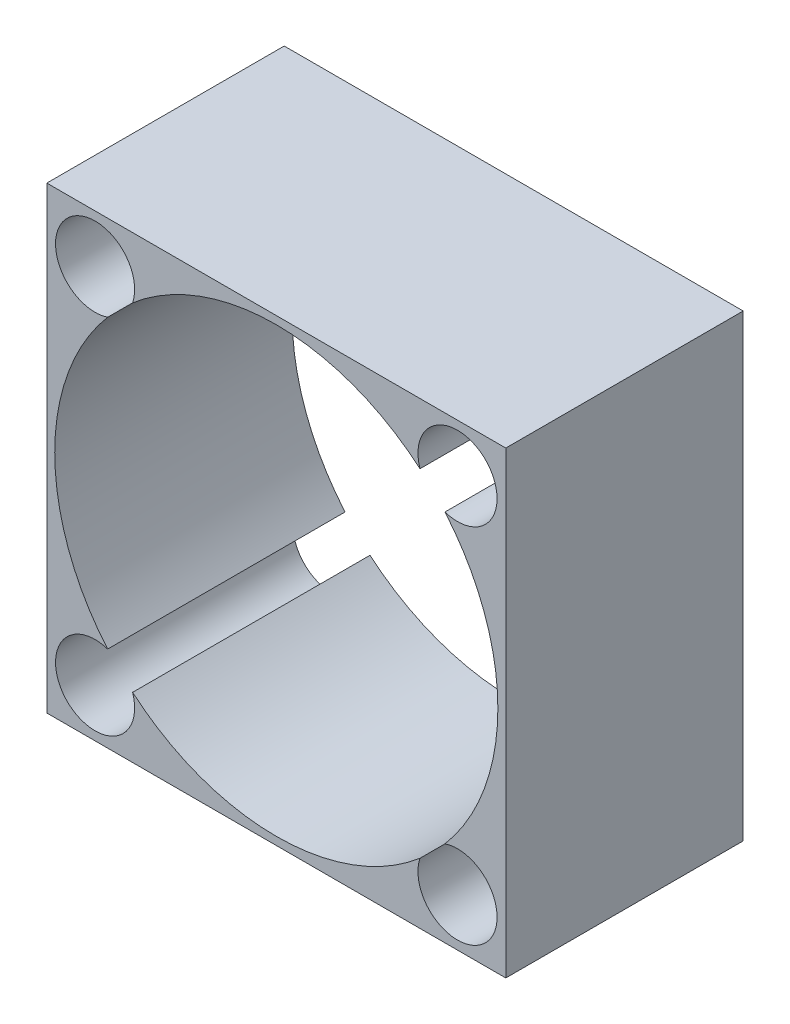
ISO-10303-21;
HEADER;
FILE_DESCRIPTION(('STEP AP214'),'2;1');
FILE_NAME('part.step','',(''),(''),'','','');
FILE_SCHEMA(('AUTOMOTIVE_DESIGN { 1 0 10303 214 1 1 1 1 }'));
ENDSEC;
DATA;
#1=APPLICATION_CONTEXT('core data for automotive mechanical design processes');
#2=APPLICATION_PROTOCOL_DEFINITION('international standard','automotive_design',2000,#1);
#3=PRODUCT_CONTEXT('',#1,'mechanical');
#4=PRODUCT('Part','Part','',(#3));
#5=PRODUCT_RELATED_PRODUCT_CATEGORY('part','',(#4));
#6=PRODUCT_DEFINITION_FORMATION('','',#4);
#7=PRODUCT_DEFINITION_CONTEXT('part definition',#1,'design');
#8=PRODUCT_DEFINITION('design','',#6,#7);
#9=PRODUCT_DEFINITION_SHAPE('','',#8);
#10=(LENGTH_UNIT() NAMED_UNIT(*) SI_UNIT(.MILLI.,.METRE.));
#11=(NAMED_UNIT(*) PLANE_ANGLE_UNIT() SI_UNIT($,.RADIAN.));
#12=(NAMED_UNIT(*) SI_UNIT($,.STERADIAN.) SOLID_ANGLE_UNIT());
#13=UNCERTAINTY_MEASURE_WITH_UNIT(LENGTH_MEASURE(1.E-05),#10,'distance_accuracy_value','');
#14=(GEOMETRIC_REPRESENTATION_CONTEXT(3) GLOBAL_UNCERTAINTY_ASSIGNED_CONTEXT((#13)) GLOBAL_UNIT_ASSIGNED_CONTEXT((#10,
#11,#12)) REPRESENTATION_CONTEXT('',''));
#15=CARTESIAN_POINT('',(0.,0.,0.));
#16=DIRECTION('',(0.,0.,1.));
#17=DIRECTION('',(1.,0.,0.));
#18=AXIS2_PLACEMENT_3D('',#15,#16,#17);
#19=CARTESIAN_POINT('',(0.,0.,30.));
#20=DIRECTION('',(0.,0.,-1.));
#21=DIRECTION('',(-1.,0.,0.));
#22=AXIS2_PLACEMENT_3D('',#19,#20,#21);
#23=CYLINDRICAL_SURFACE('',#22,28.);
#24=DIRECTION('',(0.,0.,1.));
#25=VECTOR('',#24,1.);
#26=CARTESIAN_POINT('',(-21.3137681944959,-18.1582842072508,15.));
#27=LINE('',#26,#25);
#28=CARTESIAN_POINT('',(-21.3137681944959,-18.1582842072508,0.));
#29=VERTEX_POINT('',#28);
#30=CARTESIAN_POINT('',(-21.3137681944959,-18.1582842072508,30.));
#31=VERTEX_POINT('',#30);
#32=EDGE_CURVE('E11',#29,#31,#27,.T.);
#33=ORIENTED_EDGE('',*,*,#32,.F.);
#34=CARTESIAN_POINT('',(0.,0.,0.));
#35=DIRECTION('',(0.,0.,1.));
#36=DIRECTION('',(1.,0.,0.));
#37=AXIS2_PLACEMENT_3D('',#34,#35,#36);
#38=CIRCLE('',#37,28.);
#39=CARTESIAN_POINT('',(-21.3137681944959,18.1582842072508,0.));
#40=VERTEX_POINT('',#39);
#41=EDGE_CURVE('E168',#40,#29,#38,.T.);
#42=ORIENTED_EDGE('',*,*,#41,.F.);
#43=DIRECTION('',(0.,0.,1.));
#44=VECTOR('',#43,1.);
#45=CARTESIAN_POINT('',(-21.3137681944959,18.1582842072508,15.));
#46=LINE('',#45,#44);
#47=CARTESIAN_POINT('',(-21.3137681944959,18.1582842072508,30.));
#48=VERTEX_POINT('',#47);
#49=EDGE_CURVE('E139',#48,#40,#46,.F.);
#50=ORIENTED_EDGE('',*,*,#49,.F.);
#51=CARTESIAN_POINT('',(0.,0.,30.));
#52=DIRECTION('',(0.,0.,1.));
#53=DIRECTION('',(1.,0.,0.));
#54=AXIS2_PLACEMENT_3D('',#51,#52,#53);
#55=CIRCLE('',#54,28.);
#56=EDGE_CURVE('E149',#48,#31,#55,.T.);
#57=ORIENTED_EDGE('',*,*,#56,.T.);
#58=EDGE_LOOP('',(#33,#42,#50,#57));
#59=FACE_BOUND('',#58,.T.);
#60=ADVANCED_FACE('F40',(#59),#23,.F.);
#61=DIRECTION('',(0.,0.,1.));
#62=VECTOR('',#61,1.);
#63=CARTESIAN_POINT('',(-18.1582842072508,-21.3137681944959,15.));
#64=LINE('',#63,#62);
#65=CARTESIAN_POINT('',(-18.1582842072508,-21.3137681944959,30.));
#66=VERTEX_POINT('',#65);
#67=CARTESIAN_POINT('',(-18.1582842072508,-21.3137681944959,0.));
#68=VERTEX_POINT('',#67);
#69=EDGE_CURVE('E48',#66,#68,#64,.F.);
#70=ORIENTED_EDGE('',*,*,#69,.F.);
#71=CARTESIAN_POINT('',(18.1582842072508,-21.3137681944959,30.));
#72=VERTEX_POINT('',#71);
#73=EDGE_CURVE('E160',#66,#72,#55,.T.);
#74=ORIENTED_EDGE('',*,*,#73,.T.);
#75=DIRECTION('',(0.,0.,1.));
#76=VECTOR('',#75,1.);
#77=CARTESIAN_POINT('',(18.1582842072508,-21.3137681944959,15.));
#78=LINE('',#77,#76);
#79=CARTESIAN_POINT('',(18.1582842072508,-21.3137681944959,0.));
#80=VERTEX_POINT('',#79);
#81=EDGE_CURVE('E199',#80,#72,#78,.T.);
#82=ORIENTED_EDGE('',*,*,#81,.F.);
#83=EDGE_CURVE('E173',#68,#80,#38,.T.);
#84=ORIENTED_EDGE('',*,*,#83,.F.);
#85=EDGE_LOOP('',(#70,#74,#82,#84));
#86=FACE_BOUND('',#85,.T.);
#87=ADVANCED_FACE('F197',(#86),#23,.F.);
#88=DIRECTION('',(0.,0.,1.));
#89=VECTOR('',#88,1.);
#90=CARTESIAN_POINT('',(21.3137681944959,-18.1582842072508,15.));
#91=LINE('',#90,#89);
#92=CARTESIAN_POINT('',(21.313768194496,-18.1582842072508,30.));
#93=VERTEX_POINT('',#92);
#94=CARTESIAN_POINT('',(21.313768194496,-18.1582842072508,0.));
#95=VERTEX_POINT('',#94);
#96=EDGE_CURVE('E200',#93,#95,#91,.F.);
#97=ORIENTED_EDGE('',*,*,#96,.F.);
#98=CARTESIAN_POINT('',(21.3137681944959,18.1582842072508,30.));
#99=VERTEX_POINT('',#98);
#100=EDGE_CURVE('E156',#93,#99,#55,.T.);
#101=ORIENTED_EDGE('',*,*,#100,.T.);
#102=DIRECTION('',(0.,0.,1.));
#103=VECTOR('',#102,1.);
#104=CARTESIAN_POINT('',(21.3137681944959,18.1582842072508,15.));
#105=LINE('',#104,#103);
#106=CARTESIAN_POINT('',(21.3137681944959,18.1582842072508,0.));
#107=VERTEX_POINT('',#106);
#108=EDGE_CURVE('E193',#107,#99,#105,.T.);
#109=ORIENTED_EDGE('',*,*,#108,.F.);
#110=EDGE_CURVE('E169',#95,#107,#38,.T.);
#111=ORIENTED_EDGE('',*,*,#110,.F.);
#112=EDGE_LOOP('',(#97,#101,#109,#111));
#113=FACE_BOUND('',#112,.T.);
#114=ADVANCED_FACE('F268',(#113),#23,.F.);
#115=CARTESIAN_POINT('',(0.,0.,30.));
#116=DIRECTION('',(0.,0.,1.));
#117=DIRECTION('',(1.,0.,0.));
#118=AXIS2_PLACEMENT_3D('',#115,#116,#117);
#119=PLANE('',#118);
#120=CARTESIAN_POINT('',(-22.9,-22.9,30.));
#121=DIRECTION('',(0.,0.,1.));
#122=DIRECTION('',(1.,0.,0.));
#123=AXIS2_PLACEMENT_3D('',#120,#121,#122);
#124=CIRCLE('',#123,5.);
#125=EDGE_CURVE('E62',#31,#66,#124,.T.);
#126=ORIENTED_EDGE('',*,*,#125,.F.);
#127=ORIENTED_EDGE('',*,*,#56,.F.);
#128=CARTESIAN_POINT('',(-22.9,22.9,30.));
#129=DIRECTION('',(0.,0.,1.));
#130=DIRECTION('',(1.,0.,0.));
#131=AXIS2_PLACEMENT_3D('',#128,#129,#130);
#132=CIRCLE('',#131,5.);
#133=CARTESIAN_POINT('',(-18.1582842072508,21.3137681944959,30.));
#134=VERTEX_POINT('',#133);
#135=EDGE_CURVE('E130',#134,#48,#132,.T.);
#136=ORIENTED_EDGE('',*,*,#135,.F.);
#137=CARTESIAN_POINT('',(18.1582842072508,21.3137681944959,30.));
#138=VERTEX_POINT('',#137);
#139=EDGE_CURVE('E147',#138,#134,#55,.T.);
#140=ORIENTED_EDGE('',*,*,#139,.F.);
#141=CARTESIAN_POINT('',(22.9,22.9,30.));
#142=DIRECTION('',(0.,0.,1.));
#143=DIRECTION('',(1.,0.,0.));
#144=AXIS2_PLACEMENT_3D('',#141,#142,#143);
#145=CIRCLE('',#144,5.);
#146=EDGE_CURVE('E150',#99,#138,#145,.T.);
#147=ORIENTED_EDGE('',*,*,#146,.F.);
#148=ORIENTED_EDGE('',*,*,#100,.F.);
#149=CARTESIAN_POINT('',(22.9,-22.9,30.));
#150=DIRECTION('',(0.,0.,1.));
#151=DIRECTION('',(1.,0.,0.));
#152=AXIS2_PLACEMENT_3D('',#149,#150,#151);
#153=CIRCLE('',#152,5.);
#154=EDGE_CURVE('E55',#72,#93,#153,.T.);
#155=ORIENTED_EDGE('',*,*,#154,.F.);
#156=ORIENTED_EDGE('',*,*,#73,.F.);
#157=EDGE_LOOP('',(#126,#127,#136,#140,#147,#148,#155,#156));
#158=FACE_BOUND('',#157,.T.);
#159=DIRECTION('',(0.,1.,0.));
#160=VECTOR('',#159,1.);
#161=CARTESIAN_POINT('',(29.,29.,30.));
#162=LINE('',#161,#160);
#163=CARTESIAN_POINT('',(29.,-29.,30.));
#164=VERTEX_POINT('',#163);
#165=CARTESIAN_POINT('',(29.,29.,30.));
#166=VERTEX_POINT('',#165);
#167=EDGE_CURVE('E222',#164,#166,#162,.T.);
#168=ORIENTED_EDGE('',*,*,#167,.T.);
#169=DIRECTION('',(-1.,0.,0.));
#170=VECTOR('',#169,1.);
#171=CARTESIAN_POINT('',(-29.,29.,30.));
#172=LINE('',#171,#170);
#173=CARTESIAN_POINT('',(-29.,29.,30.));
#174=VERTEX_POINT('',#173);
#175=EDGE_CURVE('E229',#166,#174,#172,.T.);
#176=ORIENTED_EDGE('',*,*,#175,.T.);
#177=DIRECTION('',(0.,-1.,0.));
#178=VECTOR('',#177,1.);
#179=CARTESIAN_POINT('',(-29.,29.,30.));
#180=LINE('',#179,#178);
#181=CARTESIAN_POINT('',(-29.,-29.,30.));
#182=VERTEX_POINT('',#181);
#183=EDGE_CURVE('E227',#174,#182,#180,.T.);
#184=ORIENTED_EDGE('',*,*,#183,.T.);
#185=DIRECTION('',(1.,0.,0.));
#186=VECTOR('',#185,1.);
#187=CARTESIAN_POINT('',(-29.,-29.,30.));
#188=LINE('',#187,#186);
#189=EDGE_CURVE('E219',#182,#164,#188,.T.);
#190=ORIENTED_EDGE('',*,*,#189,.T.);
#191=EDGE_LOOP('',(#168,#176,#184,#190));
#192=FACE_BOUND('',#191,.T.);
#193=ADVANCED_FACE('F144',(#158,#192),#119,.T.);
#194=CARTESIAN_POINT('',(0.,0.,0.));
#195=DIRECTION('',(0.,0.,1.));
#196=DIRECTION('',(1.,0.,0.));
#197=AXIS2_PLACEMENT_3D('',#194,#195,#196);
#198=PLANE('',#197);
#199=DIRECTION('',(0.,1.,0.));
#200=VECTOR('',#199,1.);
#201=CARTESIAN_POINT('',(29.,29.,0.));
#202=LINE('',#201,#200);
#203=CARTESIAN_POINT('',(29.,-29.,0.));
#204=VERTEX_POINT('',#203);
#205=CARTESIAN_POINT('',(29.,29.,0.));
#206=VERTEX_POINT('',#205);
#207=EDGE_CURVE('E154',#204,#206,#202,.T.);
#208=ORIENTED_EDGE('',*,*,#207,.F.);
#209=DIRECTION('',(1.,0.,0.));
#210=VECTOR('',#209,1.);
#211=CARTESIAN_POINT('',(-29.,-29.,0.));
#212=LINE('',#211,#210);
#213=CARTESIAN_POINT('',(-29.,-29.,0.));
#214=VERTEX_POINT('',#213);
#215=EDGE_CURVE('E220',#214,#204,#212,.T.);
#216=ORIENTED_EDGE('',*,*,#215,.F.);
#217=DIRECTION('',(0.,-1.,0.));
#218=VECTOR('',#217,1.);
#219=CARTESIAN_POINT('',(-29.,29.,0.));
#220=LINE('',#219,#218);
#221=CARTESIAN_POINT('',(-29.,29.,0.));
#222=VERTEX_POINT('',#221);
#223=EDGE_CURVE('E223',#222,#214,#220,.T.);
#224=ORIENTED_EDGE('',*,*,#223,.F.);
#225=DIRECTION('',(-1.,0.,0.));
#226=VECTOR('',#225,1.);
#227=CARTESIAN_POINT('',(-29.,29.,0.));
#228=LINE('',#227,#226);
#229=EDGE_CURVE('E158',#206,#222,#228,.T.);
#230=ORIENTED_EDGE('',*,*,#229,.F.);
#231=EDGE_LOOP('',(#208,#216,#224,#230));
#232=FACE_BOUND('',#231,.T.);
#233=ORIENTED_EDGE('',*,*,#41,.T.);
#234=CARTESIAN_POINT('',(-22.9,-22.9,0.));
#235=DIRECTION('',(0.,0.,1.));
#236=DIRECTION('',(1.,0.,0.));
#237=AXIS2_PLACEMENT_3D('',#234,#235,#236);
#238=CIRCLE('',#237,5.);
#239=EDGE_CURVE('E182',#29,#68,#238,.T.);
#240=ORIENTED_EDGE('',*,*,#239,.T.);
#241=ORIENTED_EDGE('',*,*,#83,.T.);
#242=CARTESIAN_POINT('',(22.9,-22.9,0.));
#243=DIRECTION('',(0.,0.,1.));
#244=DIRECTION('',(1.,0.,0.));
#245=AXIS2_PLACEMENT_3D('',#242,#243,#244);
#246=CIRCLE('',#245,5.);
#247=EDGE_CURVE('E186',#80,#95,#246,.T.);
#248=ORIENTED_EDGE('',*,*,#247,.T.);
#249=ORIENTED_EDGE('',*,*,#110,.T.);
#250=CARTESIAN_POINT('',(22.9,22.9,0.));
#251=DIRECTION('',(0.,0.,1.));
#252=DIRECTION('',(1.,0.,0.));
#253=AXIS2_PLACEMENT_3D('',#250,#251,#252);
#254=CIRCLE('',#253,5.);
#255=CARTESIAN_POINT('',(18.1582842072508,21.3137681944959,0.));
#256=VERTEX_POINT('',#255);
#257=EDGE_CURVE('E189',#107,#256,#254,.T.);
#258=ORIENTED_EDGE('',*,*,#257,.T.);
#259=CARTESIAN_POINT('',(-18.1582842072508,21.3137681944959,0.));
#260=VERTEX_POINT('',#259);
#261=EDGE_CURVE('E163',#256,#260,#38,.T.);
#262=ORIENTED_EDGE('',*,*,#261,.T.);
#263=CARTESIAN_POINT('',(-22.9,22.9,0.));
#264=DIRECTION('',(0.,0.,1.));
#265=DIRECTION('',(1.,0.,0.));
#266=AXIS2_PLACEMENT_3D('',#263,#264,#265);
#267=CIRCLE('',#266,5.);
#268=EDGE_CURVE('E133',#260,#40,#267,.T.);
#269=ORIENTED_EDGE('',*,*,#268,.T.);
#270=EDGE_LOOP('',(#233,#240,#241,#248,#249,#258,#262,#269));
#271=FACE_BOUND('',#270,.T.);
#272=ADVANCED_FACE('F249',(#232,#271),#198,.F.);
#273=CARTESIAN_POINT('',(29.,29.,30.));
#274=DIRECTION('',(-1.,0.,0.));
#275=DIRECTION('',(0.,-1.,0.));
#276=AXIS2_PLACEMENT_3D('',#273,#274,#275);
#277=PLANE('',#276);
#278=ORIENTED_EDGE('',*,*,#207,.T.);
#279=DIRECTION('',(0.,0.,-1.));
#280=VECTOR('',#279,1.);
#281=CARTESIAN_POINT('',(29.,29.,30.));
#282=LINE('',#281,#280);
#283=EDGE_CURVE('E207',#166,#206,#282,.T.);
#284=ORIENTED_EDGE('',*,*,#283,.F.);
#285=ORIENTED_EDGE('',*,*,#167,.F.);
#286=DIRECTION('',(0.,0.,-1.));
#287=VECTOR('',#286,1.);
#288=CARTESIAN_POINT('',(29.,-29.,30.));
#289=LINE('',#288,#287);
#290=EDGE_CURVE('E216',#164,#204,#289,.T.);
#291=ORIENTED_EDGE('',*,*,#290,.T.);
#292=EDGE_LOOP('',(#278,#284,#285,#291));
#293=FACE_BOUND('',#292,.T.);
#294=ADVANCED_FACE('F42',(#293),#277,.F.);
#295=CARTESIAN_POINT('',(-29.,29.,30.));
#296=DIRECTION('',(0.,-1.,0.));
#297=DIRECTION('',(0.,0.,-1.));
#298=AXIS2_PLACEMENT_3D('',#295,#296,#297);
#299=PLANE('',#298);
#300=ORIENTED_EDGE('',*,*,#229,.T.);
#301=DIRECTION('',(0.,0.,-1.));
#302=VECTOR('',#301,1.);
#303=CARTESIAN_POINT('',(-29.,29.,30.));
#304=LINE('',#303,#302);
#305=EDGE_CURVE('E210',#174,#222,#304,.T.);
#306=ORIENTED_EDGE('',*,*,#305,.F.);
#307=ORIENTED_EDGE('',*,*,#175,.F.);
#308=ORIENTED_EDGE('',*,*,#283,.T.);
#309=EDGE_LOOP('',(#300,#306,#307,#308));
#310=FACE_BOUND('',#309,.T.);
#311=ADVANCED_FACE('F239',(#310),#299,.F.);
#312=CARTESIAN_POINT('',(-29.,29.,30.));
#313=DIRECTION('',(1.,0.,0.));
#314=DIRECTION('',(0.,1.,0.));
#315=AXIS2_PLACEMENT_3D('',#312,#313,#314);
#316=PLANE('',#315);
#317=ORIENTED_EDGE('',*,*,#223,.T.);
#318=DIRECTION('',(0.,0.,-1.));
#319=VECTOR('',#318,1.);
#320=CARTESIAN_POINT('',(-29.,-29.,30.));
#321=LINE('',#320,#319);
#322=EDGE_CURVE('E213',#182,#214,#321,.T.);
#323=ORIENTED_EDGE('',*,*,#322,.F.);
#324=ORIENTED_EDGE('',*,*,#183,.F.);
#325=ORIENTED_EDGE('',*,*,#305,.T.);
#326=EDGE_LOOP('',(#317,#323,#324,#325));
#327=FACE_BOUND('',#326,.T.);
#328=ADVANCED_FACE('F244',(#327),#316,.F.);
#329=CARTESIAN_POINT('',(-29.,-29.,30.));
#330=DIRECTION('',(0.,1.,0.));
#331=DIRECTION('',(0.,0.,1.));
#332=AXIS2_PLACEMENT_3D('',#329,#330,#331);
#333=PLANE('',#332);
#334=ORIENTED_EDGE('',*,*,#215,.T.);
#335=ORIENTED_EDGE('',*,*,#290,.F.);
#336=ORIENTED_EDGE('',*,*,#189,.F.);
#337=ORIENTED_EDGE('',*,*,#322,.T.);
#338=EDGE_LOOP('',(#334,#335,#336,#337));
#339=FACE_BOUND('',#338,.T.);
#340=ADVANCED_FACE('F247',(#339),#333,.F.);
#341=DIRECTION('',(0.,0.,1.));
#342=VECTOR('',#341,1.);
#343=CARTESIAN_POINT('',(18.1582842072508,21.3137681944959,15.));
#344=LINE('',#343,#342);
#345=EDGE_CURVE('E138',#138,#256,#344,.F.);
#346=ORIENTED_EDGE('',*,*,#345,.F.);
#347=ORIENTED_EDGE('',*,*,#139,.T.);
#348=DIRECTION('',(0.,0.,1.));
#349=VECTOR('',#348,1.);
#350=CARTESIAN_POINT('',(-18.1582842072508,21.3137681944959,15.));
#351=LINE('',#350,#349);
#352=EDGE_CURVE('E127',#260,#134,#351,.T.);
#353=ORIENTED_EDGE('',*,*,#352,.F.);
#354=ORIENTED_EDGE('',*,*,#261,.F.);
#355=EDGE_LOOP('',(#346,#347,#353,#354));
#356=FACE_BOUND('',#355,.T.);
#357=ADVANCED_FACE('F153',(#356),#23,.F.);
#358=CARTESIAN_POINT('',(-22.9,22.9,0.));
#359=DIRECTION('',(0.,0.,1.));
#360=DIRECTION('',(1.,0.,0.));
#361=AXIS2_PLACEMENT_3D('',#358,#359,#360);
#362=CYLINDRICAL_SURFACE('',#361,5.);
#363=ORIENTED_EDGE('',*,*,#352,.T.);
#364=ORIENTED_EDGE('',*,*,#135,.T.);
#365=ORIENTED_EDGE('',*,*,#49,.T.);
#366=ORIENTED_EDGE('',*,*,#268,.F.);
#367=EDGE_LOOP('',(#363,#364,#365,#366));
#368=FACE_BOUND('',#367,.T.);
#369=ADVANCED_FACE('F129',(#368),#362,.F.);
#370=CARTESIAN_POINT('',(22.9,22.9,0.));
#371=DIRECTION('',(0.,0.,1.));
#372=DIRECTION('',(1.,0.,0.));
#373=AXIS2_PLACEMENT_3D('',#370,#371,#372);
#374=CYLINDRICAL_SURFACE('',#373,5.);
#375=ORIENTED_EDGE('',*,*,#108,.T.);
#376=ORIENTED_EDGE('',*,*,#146,.T.);
#377=ORIENTED_EDGE('',*,*,#345,.T.);
#378=ORIENTED_EDGE('',*,*,#257,.F.);
#379=EDGE_LOOP('',(#375,#376,#377,#378));
#380=FACE_BOUND('',#379,.T.);
#381=ADVANCED_FACE('F192',(#380),#374,.F.);
#382=CARTESIAN_POINT('',(22.9,-22.9,0.));
#383=DIRECTION('',(0.,0.,1.));
#384=DIRECTION('',(1.,0.,0.));
#385=AXIS2_PLACEMENT_3D('',#382,#383,#384);
#386=CYLINDRICAL_SURFACE('',#385,5.);
#387=ORIENTED_EDGE('',*,*,#81,.T.);
#388=ORIENTED_EDGE('',*,*,#154,.T.);
#389=ORIENTED_EDGE('',*,*,#96,.T.);
#390=ORIENTED_EDGE('',*,*,#247,.F.);
#391=EDGE_LOOP('',(#387,#388,#389,#390));
#392=FACE_BOUND('',#391,.T.);
#393=ADVANCED_FACE('F256',(#392),#386,.F.);
#394=CARTESIAN_POINT('',(-22.9,-22.9,0.));
#395=DIRECTION('',(0.,0.,1.));
#396=DIRECTION('',(1.,0.,0.));
#397=AXIS2_PLACEMENT_3D('',#394,#395,#396);
#398=CYLINDRICAL_SURFACE('',#397,5.);
#399=ORIENTED_EDGE('',*,*,#32,.T.);
#400=ORIENTED_EDGE('',*,*,#125,.T.);
#401=ORIENTED_EDGE('',*,*,#69,.T.);
#402=ORIENTED_EDGE('',*,*,#239,.F.);
#403=EDGE_LOOP('',(#399,#400,#401,#402));
#404=FACE_BOUND('',#403,.T.);
#405=ADVANCED_FACE('F254',(#404),#398,.F.);
#406=CLOSED_SHELL('',(#60,#87,#114,#193,#272,#294,#311,#328,#340,#357,#369,#381,#393,#405));
#407=MANIFOLD_SOLID_BREP('B2',#406);
#408=ADVANCED_BREP_SHAPE_REPRESENTATION('',(#18,#407),#14);
#409=SHAPE_DEFINITION_REPRESENTATION(#9,#408);
ENDSEC;
END-ISO-10303-21;
